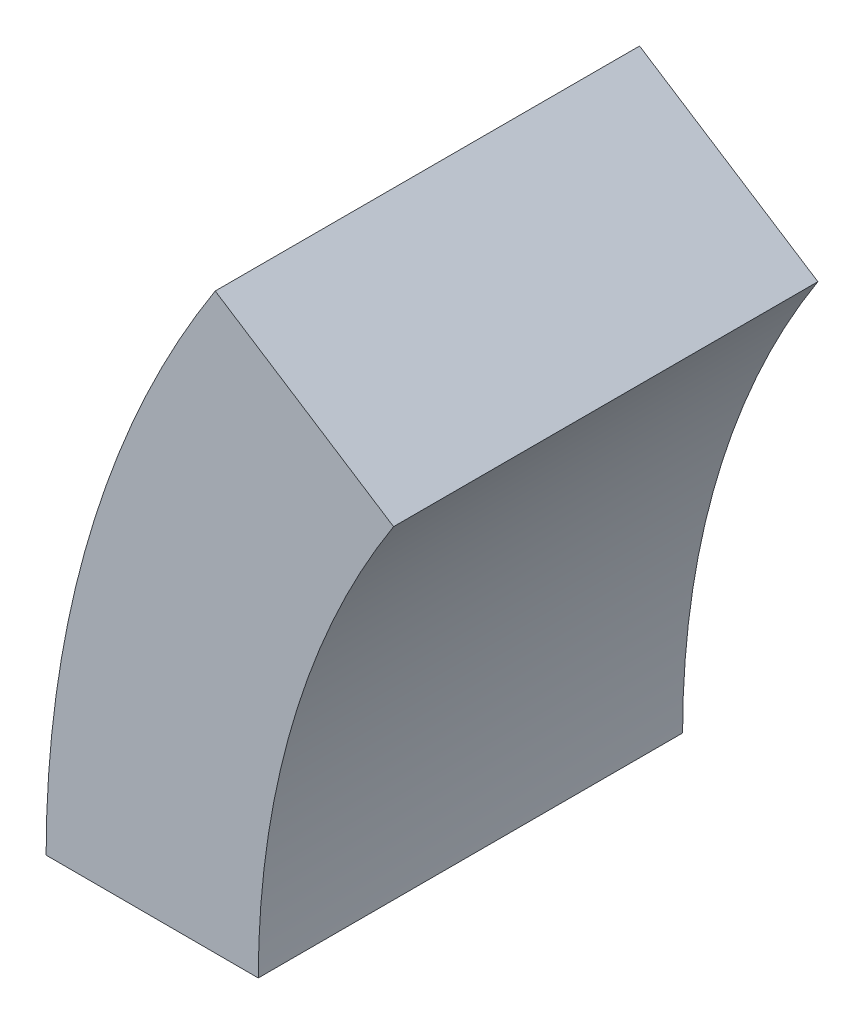
ISO-10303-21;
HEADER;
FILE_DESCRIPTION(('STEP AP214'),'2;1');
FILE_NAME('part.step','',(''),(''),'','','');
FILE_SCHEMA(('AUTOMOTIVE_DESIGN { 1 0 10303 214 1 1 1 1 }'));
ENDSEC;
DATA;
#1=APPLICATION_CONTEXT('core data for automotive mechanical design processes');
#2=APPLICATION_PROTOCOL_DEFINITION('international standard','automotive_design',2000,#1);
#3=PRODUCT_CONTEXT('',#1,'mechanical');
#4=PRODUCT('Part','Part','',(#3));
#5=PRODUCT_RELATED_PRODUCT_CATEGORY('part','',(#4));
#6=PRODUCT_DEFINITION_FORMATION('','',#4);
#7=PRODUCT_DEFINITION_CONTEXT('part definition',#1,'design');
#8=PRODUCT_DEFINITION('design','',#6,#7);
#9=PRODUCT_DEFINITION_SHAPE('','',#8);
#10=(LENGTH_UNIT() NAMED_UNIT(*) SI_UNIT(.MILLI.,.METRE.));
#11=(NAMED_UNIT(*) PLANE_ANGLE_UNIT() SI_UNIT($,.RADIAN.));
#12=(NAMED_UNIT(*) SI_UNIT($,.STERADIAN.) SOLID_ANGLE_UNIT());
#13=UNCERTAINTY_MEASURE_WITH_UNIT(LENGTH_MEASURE(1.E-05),#10,'distance_accuracy_value','');
#14=(GEOMETRIC_REPRESENTATION_CONTEXT(3) GLOBAL_UNCERTAINTY_ASSIGNED_CONTEXT((#13)) GLOBAL_UNIT_ASSIGNED_CONTEXT((#10,
#11,#12)) REPRESENTATION_CONTEXT('',''));
#15=CARTESIAN_POINT('',(0.,0.,0.));
#16=DIRECTION('',(0.,0.,1.));
#17=DIRECTION('',(1.,0.,0.));
#18=AXIS2_PLACEMENT_3D('',#15,#16,#17);
#19=CARTESIAN_POINT('',(0.,0.,25.4));
#20=DIRECTION('',(0.,0.,1.));
#21=DIRECTION('',(1.,0.,0.));
#22=AXIS2_PLACEMENT_3D('',#19,#20,#21);
#23=PLANE('',#22);
#24=DIRECTION('',(0.840566603495691,-0.54170821028273,0.));
#25=VECTOR('',#24,1.);
#26=CARTESIAN_POINT('',(0.,0.,25.4));
#27=LINE('',#26,#25);
#28=CARTESIAN_POINT('',(-53.3759793219764,34.3984713529533,25.4));
#29=VERTEX_POINT('',#28);
#30=CARTESIAN_POINT('',(-42.7007834575811,27.5187770823627,25.4));
#31=VERTEX_POINT('',#30);
#32=EDGE_CURVE('E49',#29,#31,#27,.T.);
#33=ORIENTED_EDGE('',*,*,#32,.F.);
#34=CARTESIAN_POINT('',(0.,0.,25.4));
#35=DIRECTION('',(0.,0.,1.));
#36=DIRECTION('',(1.,0.,0.));
#37=AXIS2_PLACEMENT_3D('',#34,#35,#36);
#38=CIRCLE('',#37,63.5);
#39=CARTESIAN_POINT('',(-63.4999381017504,0.0886626971926021,25.4));
#40=VERTEX_POINT('',#39);
#41=EDGE_CURVE('E94',#29,#40,#38,.T.);
#42=ORIENTED_EDGE('',*,*,#41,.T.);
#43=DIRECTION('',(0.999999025224415,-0.00139626294791499,0.));
#44=VECTOR('',#43,1.);
#45=CARTESIAN_POINT('',(0.,0.,25.4));
#46=LINE('',#45,#44);
#47=CARTESIAN_POINT('',(-50.7999504814003,0.0709301577540817,25.4));
#48=VERTEX_POINT('',#47);
#49=EDGE_CURVE('E91',#40,#48,#46,.T.);
#50=ORIENTED_EDGE('',*,*,#49,.T.);
#51=CARTESIAN_POINT('',(0.,0.,25.4));
#52=DIRECTION('',(0.,0.,1.));
#53=DIRECTION('',(1.,0.,0.));
#54=AXIS2_PLACEMENT_3D('',#51,#52,#53);
#55=CIRCLE('',#54,50.8);
#56=EDGE_CURVE('E86',#31,#48,#55,.T.);
#57=ORIENTED_EDGE('',*,*,#56,.F.);
#58=EDGE_LOOP('',(#33,#42,#50,#57));
#59=FACE_BOUND('',#58,.T.);
#60=ADVANCED_FACE('F35',(#59),#23,.T.);
#61=CARTESIAN_POINT('',(0.,0.,0.));
#62=DIRECTION('',(0.,0.,1.));
#63=DIRECTION('',(1.,0.,0.));
#64=AXIS2_PLACEMENT_3D('',#61,#62,#63);
#65=PLANE('',#64);
#66=CARTESIAN_POINT('',(0.,0.,0.));
#67=DIRECTION('',(0.,0.,1.));
#68=DIRECTION('',(1.,0.,0.));
#69=AXIS2_PLACEMENT_3D('',#66,#67,#68);
#70=CIRCLE('',#69,63.5);
#71=CARTESIAN_POINT('',(-53.3759793219764,34.3984713529533,0.));
#72=VERTEX_POINT('',#71);
#73=CARTESIAN_POINT('',(-63.4999381017504,0.0886626971926021,0.));
#74=VERTEX_POINT('',#73);
#75=EDGE_CURVE('E81',#72,#74,#70,.T.);
#76=ORIENTED_EDGE('',*,*,#75,.F.);
#77=DIRECTION('',(0.840566603495691,-0.54170821028273,0.));
#78=VECTOR('',#77,1.);
#79=CARTESIAN_POINT('',(0.,0.,0.));
#80=LINE('',#79,#78);
#81=CARTESIAN_POINT('',(-42.7007834575811,27.5187770823627,0.));
#82=VERTEX_POINT('',#81);
#83=EDGE_CURVE('E75',#72,#82,#80,.T.);
#84=ORIENTED_EDGE('',*,*,#83,.T.);
#85=CARTESIAN_POINT('',(0.,0.,0.));
#86=DIRECTION('',(0.,0.,1.));
#87=DIRECTION('',(1.,0.,0.));
#88=AXIS2_PLACEMENT_3D('',#85,#86,#87);
#89=CIRCLE('',#88,50.8);
#90=CARTESIAN_POINT('',(-50.7999504814003,0.0709301577540817,0.));
#91=VERTEX_POINT('',#90);
#92=EDGE_CURVE('E57',#82,#91,#89,.T.);
#93=ORIENTED_EDGE('',*,*,#92,.T.);
#94=DIRECTION('',(0.999999025224415,-0.00139626294791499,0.));
#95=VECTOR('',#94,1.);
#96=CARTESIAN_POINT('',(0.,0.,0.));
#97=LINE('',#96,#95);
#98=EDGE_CURVE('E103',#74,#91,#97,.T.);
#99=ORIENTED_EDGE('',*,*,#98,.F.);
#100=EDGE_LOOP('',(#76,#84,#93,#99));
#101=FACE_BOUND('',#100,.T.);
#102=ADVANCED_FACE('F80',(#101),#65,.F.);
#103=CARTESIAN_POINT('',(0.,0.,25.4));
#104=DIRECTION('',(0.,0.,-1.));
#105=DIRECTION('',(-1.,0.,0.));
#106=AXIS2_PLACEMENT_3D('',#103,#104,#105);
#107=CYLINDRICAL_SURFACE('',#106,63.5);
#108=ORIENTED_EDGE('',*,*,#41,.F.);
#109=DIRECTION('',(0.,0.,-1.));
#110=VECTOR('',#109,1.);
#111=CARTESIAN_POINT('',(-53.3759793219764,34.3984713529533,25.4));
#112=LINE('',#111,#110);
#113=EDGE_CURVE('E99',#29,#72,#112,.T.);
#114=ORIENTED_EDGE('',*,*,#113,.T.);
#115=ORIENTED_EDGE('',*,*,#75,.T.);
#116=DIRECTION('',(0.,0.,-1.));
#117=VECTOR('',#116,1.);
#118=CARTESIAN_POINT('',(-63.4999381017504,0.0886626971926021,25.4));
#119=LINE('',#118,#117);
#120=EDGE_CURVE('E87',#40,#74,#119,.T.);
#121=ORIENTED_EDGE('',*,*,#120,.F.);
#122=EDGE_LOOP('',(#108,#114,#115,#121));
#123=FACE_BOUND('',#122,.T.);
#124=ADVANCED_FACE('F37',(#123),#107,.T.);
#125=CARTESIAN_POINT('',(0.,0.,25.4));
#126=DIRECTION('',(0.,0.,-1.));
#127=DIRECTION('',(-1.,0.,0.));
#128=AXIS2_PLACEMENT_3D('',#125,#126,#127);
#129=CYLINDRICAL_SURFACE('',#128,50.8);
#130=DIRECTION('',(0.,0.,-1.));
#131=VECTOR('',#130,1.);
#132=CARTESIAN_POINT('',(-42.7007834575811,27.5187770823627,25.4));
#133=LINE('',#132,#131);
#134=EDGE_CURVE('E11',#31,#82,#133,.T.);
#135=ORIENTED_EDGE('',*,*,#134,.F.);
#136=ORIENTED_EDGE('',*,*,#56,.T.);
#137=DIRECTION('',(0.,0.,-1.));
#138=VECTOR('',#137,1.);
#139=CARTESIAN_POINT('',(-50.7999504814003,0.0709301577540817,25.4));
#140=LINE('',#139,#138);
#141=EDGE_CURVE('E43',#48,#91,#140,.T.);
#142=ORIENTED_EDGE('',*,*,#141,.T.);
#143=ORIENTED_EDGE('',*,*,#92,.F.);
#144=EDGE_LOOP('',(#135,#136,#142,#143));
#145=FACE_BOUND('',#144,.T.);
#146=ADVANCED_FACE('F84',(#145),#129,.F.);
#147=CARTESIAN_POINT('',(0.,0.,0.));
#148=DIRECTION('',(-0.00139626294791499,-0.999999025224415,0.));
#149=DIRECTION('',(0.,0.,-1.));
#150=AXIS2_PLACEMENT_3D('',#147,#148,#149);
#151=PLANE('',#150);
#152=ORIENTED_EDGE('',*,*,#120,.T.);
#153=ORIENTED_EDGE('',*,*,#98,.T.);
#154=ORIENTED_EDGE('',*,*,#141,.F.);
#155=ORIENTED_EDGE('',*,*,#49,.F.);
#156=EDGE_LOOP('',(#152,#153,#154,#155));
#157=FACE_BOUND('',#156,.T.);
#158=ADVANCED_FACE('F102',(#157),#151,.T.);
#159=CARTESIAN_POINT('',(0.,0.,0.));
#160=DIRECTION('',(-0.54170821028273,-0.840566603495691,0.));
#161=DIRECTION('',(0.,0.,-1.));
#162=AXIS2_PLACEMENT_3D('',#159,#160,#161);
#163=PLANE('',#162);
#164=ORIENTED_EDGE('',*,*,#32,.T.);
#165=ORIENTED_EDGE('',*,*,#134,.T.);
#166=ORIENTED_EDGE('',*,*,#83,.F.);
#167=ORIENTED_EDGE('',*,*,#113,.F.);
#168=EDGE_LOOP('',(#164,#165,#166,#167));
#169=FACE_BOUND('',#168,.T.);
#170=ADVANCED_FACE('F74',(#169),#163,.F.);
#171=CLOSED_SHELL('',(#60,#102,#124,#146,#158,#170));
#172=MANIFOLD_SOLID_BREP('B2',#171);
#173=ADVANCED_BREP_SHAPE_REPRESENTATION('',(#18,#172),#14);
#174=SHAPE_DEFINITION_REPRESENTATION(#9,#173);
ENDSEC;
END-ISO-10303-21;
